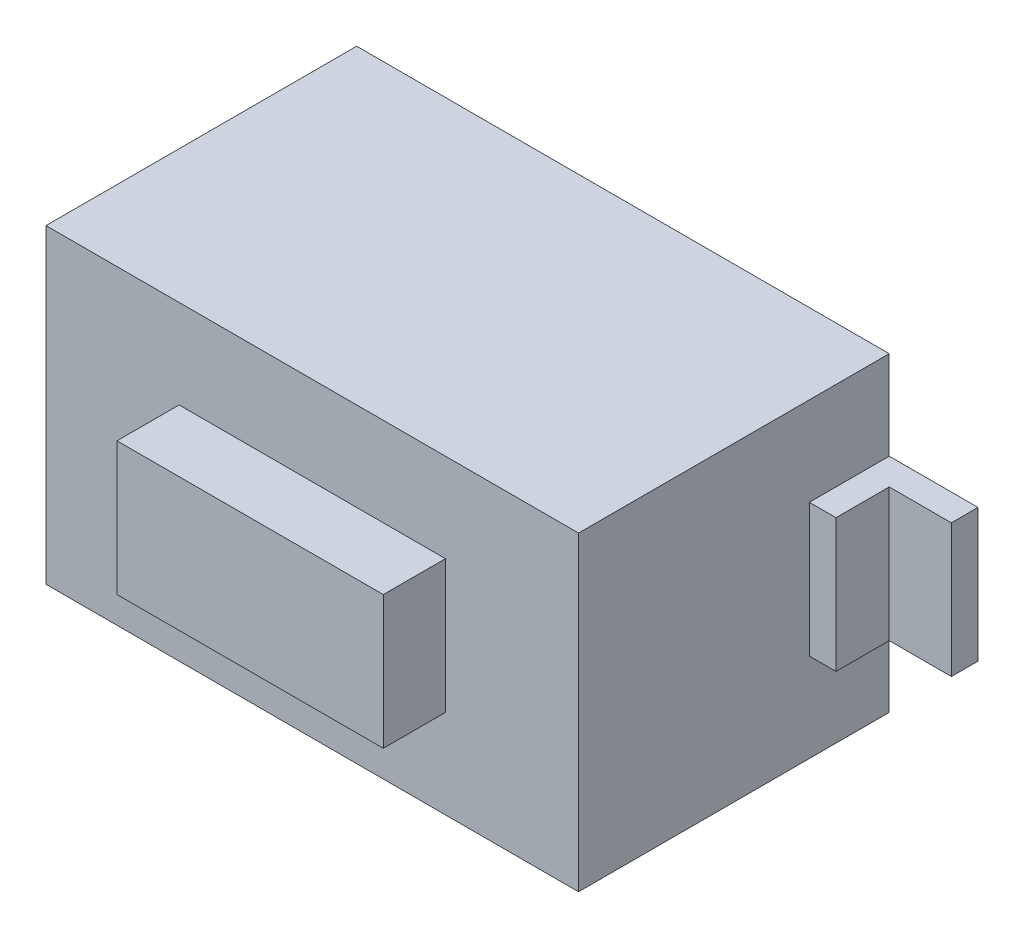
ISO-10303-21;
HEADER;
FILE_DESCRIPTION(('STEP AP214'),'2;1');
FILE_NAME('part.step','',(''),(''),'','','');
FILE_SCHEMA(('AUTOMOTIVE_DESIGN { 1 0 10303 214 1 1 1 1 }'));
ENDSEC;
DATA;
#1=APPLICATION_CONTEXT('core data for automotive mechanical design processes');
#2=APPLICATION_PROTOCOL_DEFINITION('international standard','automotive_design',2000,#1);
#3=PRODUCT_CONTEXT('',#1,'mechanical');
#4=PRODUCT('Part','Part','',(#3));
#5=PRODUCT_RELATED_PRODUCT_CATEGORY('part','',(#4));
#6=PRODUCT_DEFINITION_FORMATION('','',#4);
#7=PRODUCT_DEFINITION_CONTEXT('part definition',#1,'design');
#8=PRODUCT_DEFINITION('design','',#6,#7);
#9=PRODUCT_DEFINITION_SHAPE('','',#8);
#10=(LENGTH_UNIT() NAMED_UNIT(*) SI_UNIT(.MILLI.,.METRE.));
#11=(NAMED_UNIT(*) PLANE_ANGLE_UNIT() SI_UNIT($,.RADIAN.));
#12=(NAMED_UNIT(*) SI_UNIT($,.STERADIAN.) SOLID_ANGLE_UNIT());
#13=UNCERTAINTY_MEASURE_WITH_UNIT(LENGTH_MEASURE(1.E-05),#10,'distance_accuracy_value','');
#14=(GEOMETRIC_REPRESENTATION_CONTEXT(3) GLOBAL_UNCERTAINTY_ASSIGNED_CONTEXT((#13)) GLOBAL_UNIT_ASSIGNED_CONTEXT((#10,
#11,#12)) REPRESENTATION_CONTEXT('',''));
#15=CARTESIAN_POINT('',(0.,0.,0.));
#16=DIRECTION('',(0.,0.,1.));
#17=DIRECTION('',(1.,0.,0.));
#18=AXIS2_PLACEMENT_3D('',#15,#16,#17);
#19=CARTESIAN_POINT('',(-3.,-1.75,3.5));
#20=DIRECTION('',(1.,0.,0.));
#21=DIRECTION('',(0.,0.,-1.));
#22=AXIS2_PLACEMENT_3D('',#19,#20,#21);
#23=PLANE('',#22);
#24=DIRECTION('',(0.,1.,0.));
#25=VECTOR('',#24,1.);
#26=CARTESIAN_POINT('',(-3.,-0.75,0.9));
#27=LINE('',#26,#25);
#28=CARTESIAN_POINT('',(-3.,-0.750000000000001,0.9));
#29=VERTEX_POINT('',#28);
#30=CARTESIAN_POINT('',(-3.,0.75,0.9));
#31=VERTEX_POINT('',#30);
#32=EDGE_CURVE('E254',#29,#31,#27,.T.);
#33=ORIENTED_EDGE('',*,*,#32,.F.);
#34=DIRECTION('',(0.,0.,1.));
#35=VECTOR('',#34,1.);
#36=CARTESIAN_POINT('',(-3.,-0.75,0.));
#37=LINE('',#36,#35);
#38=CARTESIAN_POINT('',(-3.,-0.75,0.));
#39=VERTEX_POINT('',#38);
#40=EDGE_CURVE('E278',#39,#29,#37,.T.);
#41=ORIENTED_EDGE('',*,*,#40,.F.);
#42=DIRECTION('',(0.,-1.,0.));
#43=VECTOR('',#42,1.);
#44=CARTESIAN_POINT('',(-3.,-1.75,0.));
#45=LINE('',#44,#43);
#46=CARTESIAN_POINT('',(-3.,-1.75,0.));
#47=VERTEX_POINT('',#46);
#48=EDGE_CURVE('E373',#39,#47,#45,.T.);
#49=ORIENTED_EDGE('',*,*,#48,.T.);
#50=DIRECTION('',(0.,0.,-1.));
#51=VECTOR('',#50,1.);
#52=CARTESIAN_POINT('',(-3.,-1.75,3.5));
#53=LINE('',#52,#51);
#54=CARTESIAN_POINT('',(-3.,-1.75,3.5));
#55=VERTEX_POINT('',#54);
#56=EDGE_CURVE('E381',#55,#47,#53,.T.);
#57=ORIENTED_EDGE('',*,*,#56,.F.);
#58=DIRECTION('',(0.,-1.,0.));
#59=VECTOR('',#58,1.);
#60=CARTESIAN_POINT('',(-3.,-1.75,3.5));
#61=LINE('',#60,#59);
#62=CARTESIAN_POINT('',(-3.,1.75,3.5));
#63=VERTEX_POINT('',#62);
#64=EDGE_CURVE('E360',#63,#55,#61,.T.);
#65=ORIENTED_EDGE('',*,*,#64,.F.);
#66=DIRECTION('',(0.,0.,-1.));
#67=VECTOR('',#66,1.);
#68=CARTESIAN_POINT('',(-3.,1.75,3.5));
#69=LINE('',#68,#67);
#70=CARTESIAN_POINT('',(-3.,1.75,0.));
#71=VERTEX_POINT('',#70);
#72=EDGE_CURVE('E47',#63,#71,#69,.T.);
#73=ORIENTED_EDGE('',*,*,#72,.T.);
#74=CARTESIAN_POINT('',(-3.,0.75,0.));
#75=VERTEX_POINT('',#74);
#76=EDGE_CURVE('E374',#71,#75,#45,.T.);
#77=ORIENTED_EDGE('',*,*,#76,.T.);
#78=DIRECTION('',(0.,0.,-1.));
#79=VECTOR('',#78,1.);
#80=CARTESIAN_POINT('',(-3.,0.75,0.));
#81=LINE('',#80,#79);
#82=EDGE_CURVE('E272',#31,#75,#81,.T.);
#83=ORIENTED_EDGE('',*,*,#82,.F.);
#84=EDGE_LOOP('',(#33,#41,#49,#57,#65,#73,#77,#83));
#85=FACE_BOUND('',#84,.T.);
#86=ADVANCED_FACE('F38',(#85),#23,.F.);
#87=CARTESIAN_POINT('',(-4.,0.75,0.3));
#88=DIRECTION('',(0.,0.,-1.));
#89=DIRECTION('',(0.,1.,0.));
#90=AXIS2_PLACEMENT_3D('',#87,#88,#89);
#91=PLANE('',#90);
#92=DIRECTION('',(0.,-1.,0.));
#93=VECTOR('',#92,1.);
#94=CARTESIAN_POINT('',(-3.3,-0.75,0.3));
#95=LINE('',#94,#93);
#96=CARTESIAN_POINT('',(-3.3,0.75,0.3));
#97=VERTEX_POINT('',#96);
#98=CARTESIAN_POINT('',(-3.3,-0.75,0.3));
#99=VERTEX_POINT('',#98);
#100=EDGE_CURVE('E245',#97,#99,#95,.T.);
#101=ORIENTED_EDGE('',*,*,#100,.F.);
#102=DIRECTION('',(1.,0.,0.));
#103=VECTOR('',#102,1.);
#104=CARTESIAN_POINT('',(-4.,0.75,0.3));
#105=LINE('',#104,#103);
#106=CARTESIAN_POINT('',(-4.,0.75,0.3));
#107=VERTEX_POINT('',#106);
#108=EDGE_CURVE('E303',#107,#97,#105,.T.);
#109=ORIENTED_EDGE('',*,*,#108,.F.);
#110=DIRECTION('',(0.,1.,0.));
#111=VECTOR('',#110,1.);
#112=CARTESIAN_POINT('',(-4.,0.75,0.3));
#113=LINE('',#112,#111);
#114=CARTESIAN_POINT('',(-4.,-0.75,0.3));
#115=VERTEX_POINT('',#114);
#116=EDGE_CURVE('E273',#115,#107,#113,.T.);
#117=ORIENTED_EDGE('',*,*,#116,.F.);
#118=DIRECTION('',(1.,0.,0.));
#119=VECTOR('',#118,1.);
#120=CARTESIAN_POINT('',(-4.,-0.75,0.3));
#121=LINE('',#120,#119);
#122=EDGE_CURVE('E287',#115,#99,#121,.T.);
#123=ORIENTED_EDGE('',*,*,#122,.T.);
#124=EDGE_LOOP('',(#101,#109,#117,#123));
#125=FACE_BOUND('',#124,.T.);
#126=ADVANCED_FACE('F445',(#125),#91,.F.);
#127=CARTESIAN_POINT('',(0.,0.,3.5));
#128=DIRECTION('',(0.,0.,-1.));
#129=DIRECTION('',(-1.,0.,0.));
#130=AXIS2_PLACEMENT_3D('',#127,#128,#129);
#131=PLANE('',#130);
#132=DIRECTION('',(0.,1.,0.));
#133=VECTOR('',#132,1.);
#134=CARTESIAN_POINT('',(3.,-1.75,3.5));
#135=LINE('',#134,#133);
#136=CARTESIAN_POINT('',(3.,-1.75,3.5));
#137=VERTEX_POINT('',#136);
#138=CARTESIAN_POINT('',(3.,1.75,3.5));
#139=VERTEX_POINT('',#138);
#140=EDGE_CURVE('E352',#137,#139,#135,.T.);
#141=ORIENTED_EDGE('',*,*,#140,.T.);
#142=DIRECTION('',(-1.,0.,0.));
#143=VECTOR('',#142,1.);
#144=CARTESIAN_POINT('',(-3.,1.75,3.5));
#145=LINE('',#144,#143);
#146=EDGE_CURVE('E356',#139,#63,#145,.T.);
#147=ORIENTED_EDGE('',*,*,#146,.T.);
#148=ORIENTED_EDGE('',*,*,#64,.T.);
#149=DIRECTION('',(1.,0.,0.));
#150=VECTOR('',#149,1.);
#151=CARTESIAN_POINT('',(-3.,-1.75,3.5));
#152=LINE('',#151,#150);
#153=EDGE_CURVE('E363',#55,#137,#152,.T.);
#154=ORIENTED_EDGE('',*,*,#153,.T.);
#155=EDGE_LOOP('',(#141,#147,#148,#154));
#156=FACE_BOUND('',#155,.T.);
#157=DIRECTION('',(0.,-1.,0.));
#158=VECTOR('',#157,1.);
#159=CARTESIAN_POINT('',(-1.5,0.75,3.5));
#160=LINE('',#159,#158);
#161=CARTESIAN_POINT('',(-1.5,0.75,3.5));
#162=VERTEX_POINT('',#161);
#163=CARTESIAN_POINT('',(-1.5,-0.75,3.5));
#164=VERTEX_POINT('',#163);
#165=EDGE_CURVE('E307',#162,#164,#160,.T.);
#166=ORIENTED_EDGE('',*,*,#165,.F.);
#167=DIRECTION('',(-1.,0.,0.));
#168=VECTOR('',#167,1.);
#169=CARTESIAN_POINT('',(1.5,0.75,3.5));
#170=LINE('',#169,#168);
#171=CARTESIAN_POINT('',(1.5,0.75,3.5));
#172=VERTEX_POINT('',#171);
#173=EDGE_CURVE('E313',#172,#162,#170,.T.);
#174=ORIENTED_EDGE('',*,*,#173,.F.);
#175=DIRECTION('',(0.,1.,0.));
#176=VECTOR('',#175,1.);
#177=CARTESIAN_POINT('',(1.5,0.75,3.5));
#178=LINE('',#177,#176);
#179=CARTESIAN_POINT('',(1.5,-0.75,3.5));
#180=VERTEX_POINT('',#179);
#181=EDGE_CURVE('E330',#180,#172,#178,.T.);
#182=ORIENTED_EDGE('',*,*,#181,.F.);
#183=DIRECTION('',(1.,0.,0.));
#184=VECTOR('',#183,1.);
#185=CARTESIAN_POINT('',(1.5,-0.75,3.5));
#186=LINE('',#185,#184);
#187=EDGE_CURVE('E326',#164,#180,#186,.T.);
#188=ORIENTED_EDGE('',*,*,#187,.F.);
#189=EDGE_LOOP('',(#166,#174,#182,#188));
#190=FACE_BOUND('',#189,.T.);
#191=ADVANCED_FACE('F434',(#156,#190),#131,.F.);
#192=CARTESIAN_POINT('',(3.,-1.75,3.5));
#193=DIRECTION('',(-1.,0.,0.));
#194=DIRECTION('',(0.,0.,1.));
#195=AXIS2_PLACEMENT_3D('',#192,#193,#194);
#196=PLANE('',#195);
#197=DIRECTION('',(0.,1.,0.));
#198=VECTOR('',#197,1.);
#199=CARTESIAN_POINT('',(3.,-0.75,0.9));
#200=LINE('',#199,#198);
#201=CARTESIAN_POINT('',(3.,-0.750000000000001,0.9));
#202=VERTEX_POINT('',#201);
#203=CARTESIAN_POINT('',(3.,0.75,0.9));
#204=VERTEX_POINT('',#203);
#205=EDGE_CURVE('E199',#202,#204,#200,.T.);
#206=ORIENTED_EDGE('',*,*,#205,.T.);
#207=DIRECTION('',(0.,0.,-1.));
#208=VECTOR('',#207,1.);
#209=CARTESIAN_POINT('',(3.,0.75,0.));
#210=LINE('',#209,#208);
#211=CARTESIAN_POINT('',(3.,0.75,0.));
#212=VERTEX_POINT('',#211);
#213=EDGE_CURVE('E54',#204,#212,#210,.T.);
#214=ORIENTED_EDGE('',*,*,#213,.T.);
#215=DIRECTION('',(0.,1.,0.));
#216=VECTOR('',#215,1.);
#217=CARTESIAN_POINT('',(3.,-1.75,0.));
#218=LINE('',#217,#216);
#219=CARTESIAN_POINT('',(3.,1.75,0.));
#220=VERTEX_POINT('',#219);
#221=EDGE_CURVE('E351',#212,#220,#218,.T.);
#222=ORIENTED_EDGE('',*,*,#221,.T.);
#223=DIRECTION('',(0.,0.,-1.));
#224=VECTOR('',#223,1.);
#225=CARTESIAN_POINT('',(3.,1.75,3.5));
#226=LINE('',#225,#224);
#227=EDGE_CURVE('E11',#139,#220,#226,.T.);
#228=ORIENTED_EDGE('',*,*,#227,.F.);
#229=ORIENTED_EDGE('',*,*,#140,.F.);
#230=DIRECTION('',(0.,0.,-1.));
#231=VECTOR('',#230,1.);
#232=CARTESIAN_POINT('',(3.,-1.75,3.5));
#233=LINE('',#232,#231);
#234=CARTESIAN_POINT('',(3.,-1.75,0.));
#235=VERTEX_POINT('',#234);
#236=EDGE_CURVE('E366',#137,#235,#233,.T.);
#237=ORIENTED_EDGE('',*,*,#236,.T.);
#238=CARTESIAN_POINT('',(3.,-0.75,0.));
#239=VERTEX_POINT('',#238);
#240=EDGE_CURVE('E367',#235,#239,#218,.T.);
#241=ORIENTED_EDGE('',*,*,#240,.T.);
#242=DIRECTION('',(0.,0.,1.));
#243=VECTOR('',#242,1.);
#244=CARTESIAN_POINT('',(3.,-0.75,0.));
#245=LINE('',#244,#243);
#246=EDGE_CURVE('E61',#239,#202,#245,.T.);
#247=ORIENTED_EDGE('',*,*,#246,.T.);
#248=EDGE_LOOP('',(#206,#214,#222,#228,#229,#237,#241,#247));
#249=FACE_BOUND('',#248,.T.);
#250=ADVANCED_FACE('F40',(#249),#196,.F.);
#251=CARTESIAN_POINT('',(-3.,1.75,3.5));
#252=DIRECTION('',(0.,-1.,0.));
#253=DIRECTION('',(0.,0.,-1.));
#254=AXIS2_PLACEMENT_3D('',#251,#252,#253);
#255=PLANE('',#254);
#256=DIRECTION('',(-1.,0.,0.));
#257=VECTOR('',#256,1.);
#258=CARTESIAN_POINT('',(-3.,1.75,0.));
#259=LINE('',#258,#257);
#260=EDGE_CURVE('E370',#220,#71,#259,.T.);
#261=ORIENTED_EDGE('',*,*,#260,.T.);
#262=ORIENTED_EDGE('',*,*,#72,.F.);
#263=ORIENTED_EDGE('',*,*,#146,.F.);
#264=ORIENTED_EDGE('',*,*,#227,.T.);
#265=EDGE_LOOP('',(#261,#262,#263,#264));
#266=FACE_BOUND('',#265,.T.);
#267=ADVANCED_FACE('F436',(#266),#255,.F.);
#268=CARTESIAN_POINT('',(-3.,-1.75,3.5));
#269=DIRECTION('',(0.,1.,0.));
#270=DIRECTION('',(0.,0.,1.));
#271=AXIS2_PLACEMENT_3D('',#268,#269,#270);
#272=PLANE('',#271);
#273=DIRECTION('',(1.,0.,0.));
#274=VECTOR('',#273,1.);
#275=CARTESIAN_POINT('',(-3.,-1.75,0.));
#276=LINE('',#275,#274);
#277=EDGE_CURVE('E357',#47,#235,#276,.T.);
#278=ORIENTED_EDGE('',*,*,#277,.T.);
#279=ORIENTED_EDGE('',*,*,#236,.F.);
#280=ORIENTED_EDGE('',*,*,#153,.F.);
#281=ORIENTED_EDGE('',*,*,#56,.T.);
#282=EDGE_LOOP('',(#278,#279,#280,#281));
#283=FACE_BOUND('',#282,.T.);
#284=ADVANCED_FACE('F432',(#283),#272,.F.);
#285=CARTESIAN_POINT('',(0.,0.,0.));
#286=DIRECTION('',(0.,0.,-1.));
#287=DIRECTION('',(-1.,0.,0.));
#288=AXIS2_PLACEMENT_3D('',#285,#286,#287);
#289=PLANE('',#288);
#290=ORIENTED_EDGE('',*,*,#240,.F.);
#291=ORIENTED_EDGE('',*,*,#277,.F.);
#292=ORIENTED_EDGE('',*,*,#48,.F.);
#293=DIRECTION('',(1.,0.,0.));
#294=VECTOR('',#293,1.);
#295=CARTESIAN_POINT('',(-4.,-0.75,0.));
#296=LINE('',#295,#294);
#297=CARTESIAN_POINT('',(-4.,-0.75,0.));
#298=VERTEX_POINT('',#297);
#299=EDGE_CURVE('E295',#298,#39,#296,.T.);
#300=ORIENTED_EDGE('',*,*,#299,.F.);
#301=DIRECTION('',(0.,-1.,0.));
#302=VECTOR('',#301,1.);
#303=CARTESIAN_POINT('',(-4.,0.75,0.));
#304=LINE('',#303,#302);
#305=CARTESIAN_POINT('',(-4.,0.75,0.));
#306=VERTEX_POINT('',#305);
#307=EDGE_CURVE('E281',#306,#298,#304,.T.);
#308=ORIENTED_EDGE('',*,*,#307,.F.);
#309=DIRECTION('',(1.,0.,0.));
#310=VECTOR('',#309,1.);
#311=CARTESIAN_POINT('',(-4.,0.75,0.));
#312=LINE('',#311,#310);
#313=EDGE_CURVE('E299',#306,#75,#312,.T.);
#314=ORIENTED_EDGE('',*,*,#313,.T.);
#315=ORIENTED_EDGE('',*,*,#76,.F.);
#316=ORIENTED_EDGE('',*,*,#260,.F.);
#317=ORIENTED_EDGE('',*,*,#221,.F.);
#318=DIRECTION('',(-1.,0.,0.));
#319=VECTOR('',#318,1.);
#320=CARTESIAN_POINT('',(4.,0.75,0.));
#321=LINE('',#320,#319);
#322=CARTESIAN_POINT('',(4.,0.75,0.));
#323=VERTEX_POINT('',#322);
#324=EDGE_CURVE('E235',#323,#212,#321,.T.);
#325=ORIENTED_EDGE('',*,*,#324,.F.);
#326=DIRECTION('',(0.,-1.,0.));
#327=VECTOR('',#326,1.);
#328=CARTESIAN_POINT('',(4.,0.75,0.));
#329=LINE('',#328,#327);
#330=CARTESIAN_POINT('',(4.,-0.75,0.));
#331=VERTEX_POINT('',#330);
#332=EDGE_CURVE('E220',#323,#331,#329,.T.);
#333=ORIENTED_EDGE('',*,*,#332,.T.);
#334=DIRECTION('',(-1.,0.,0.));
#335=VECTOR('',#334,1.);
#336=CARTESIAN_POINT('',(4.,-0.75,0.));
#337=LINE('',#336,#335);
#338=EDGE_CURVE('E238',#331,#239,#337,.T.);
#339=ORIENTED_EDGE('',*,*,#338,.T.);
#340=EDGE_LOOP('',(#290,#291,#292,#300,#308,#314,#315,#316,#317,#325,#333,#339));
#341=FACE_BOUND('',#340,.T.);
#342=ADVANCED_FACE('F396',(#341),#289,.T.);
#343=CARTESIAN_POINT('',(-1.5,0.75,4.2));
#344=DIRECTION('',(1.,0.,0.));
#345=DIRECTION('',(0.,0.,-1.));
#346=AXIS2_PLACEMENT_3D('',#343,#344,#345);
#347=PLANE('',#346);
#348=ORIENTED_EDGE('',*,*,#165,.T.);
#349=DIRECTION('',(0.,0.,-1.));
#350=VECTOR('',#349,1.);
#351=CARTESIAN_POINT('',(-1.5,-0.75,4.2));
#352=LINE('',#351,#350);
#353=CARTESIAN_POINT('',(-1.5,-0.75,4.2));
#354=VERTEX_POINT('',#353);
#355=EDGE_CURVE('E347',#354,#164,#352,.T.);
#356=ORIENTED_EDGE('',*,*,#355,.F.);
#357=DIRECTION('',(0.,-1.,0.));
#358=VECTOR('',#357,1.);
#359=CARTESIAN_POINT('',(-1.5,0.75,4.2));
#360=LINE('',#359,#358);
#361=CARTESIAN_POINT('',(-1.5,0.75,4.2));
#362=VERTEX_POINT('',#361);
#363=EDGE_CURVE('E308',#362,#354,#360,.T.);
#364=ORIENTED_EDGE('',*,*,#363,.F.);
#365=DIRECTION('',(0.,0.,-1.));
#366=VECTOR('',#365,1.);
#367=CARTESIAN_POINT('',(-1.5,0.75,4.2));
#368=LINE('',#367,#366);
#369=EDGE_CURVE('E322',#362,#162,#368,.T.);
#370=ORIENTED_EDGE('',*,*,#369,.T.);
#371=EDGE_LOOP('',(#348,#356,#364,#370));
#372=FACE_BOUND('',#371,.T.);
#373=ADVANCED_FACE('F454',(#372),#347,.F.);
#374=CARTESIAN_POINT('',(1.5,-0.75,4.2));
#375=DIRECTION('',(0.,1.,0.));
#376=DIRECTION('',(-1.,0.,0.));
#377=AXIS2_PLACEMENT_3D('',#374,#375,#376);
#378=PLANE('',#377);
#379=ORIENTED_EDGE('',*,*,#187,.T.);
#380=DIRECTION('',(0.,0.,-1.));
#381=VECTOR('',#380,1.);
#382=CARTESIAN_POINT('',(1.5,-0.75,4.2));
#383=LINE('',#382,#381);
#384=CARTESIAN_POINT('',(1.5,-0.75,4.2));
#385=VERTEX_POINT('',#384);
#386=EDGE_CURVE('E344',#385,#180,#383,.T.);
#387=ORIENTED_EDGE('',*,*,#386,.F.);
#388=DIRECTION('',(1.,0.,0.));
#389=VECTOR('',#388,1.);
#390=CARTESIAN_POINT('',(1.5,-0.75,4.2));
#391=LINE('',#390,#389);
#392=EDGE_CURVE('E312',#354,#385,#391,.T.);
#393=ORIENTED_EDGE('',*,*,#392,.F.);
#394=ORIENTED_EDGE('',*,*,#355,.T.);
#395=EDGE_LOOP('',(#379,#387,#393,#394));
#396=FACE_BOUND('',#395,.T.);
#397=ADVANCED_FACE('F459',(#396),#378,.F.);
#398=CARTESIAN_POINT('',(1.5,0.75,4.2));
#399=DIRECTION('',(-1.,0.,0.));
#400=DIRECTION('',(0.,0.,1.));
#401=AXIS2_PLACEMENT_3D('',#398,#399,#400);
#402=PLANE('',#401);
#403=ORIENTED_EDGE('',*,*,#181,.T.);
#404=DIRECTION('',(0.,0.,-1.));
#405=VECTOR('',#404,1.);
#406=CARTESIAN_POINT('',(1.5,0.75,4.2));
#407=LINE('',#406,#405);
#408=CARTESIAN_POINT('',(1.5,0.75,4.2));
#409=VERTEX_POINT('',#408);
#410=EDGE_CURVE('E340',#409,#172,#407,.T.);
#411=ORIENTED_EDGE('',*,*,#410,.F.);
#412=DIRECTION('',(0.,1.,0.));
#413=VECTOR('',#412,1.);
#414=CARTESIAN_POINT('',(1.5,0.75,4.2));
#415=LINE('',#414,#413);
#416=EDGE_CURVE('E316',#385,#409,#415,.T.);
#417=ORIENTED_EDGE('',*,*,#416,.F.);
#418=ORIENTED_EDGE('',*,*,#386,.T.);
#419=EDGE_LOOP('',(#403,#411,#417,#418));
#420=FACE_BOUND('',#419,.T.);
#421=ADVANCED_FACE('F463',(#420),#402,.F.);
#422=CARTESIAN_POINT('',(1.5,0.75,4.2));
#423=DIRECTION('',(0.,-1.,0.));
#424=DIRECTION('',(1.,0.,0.));
#425=AXIS2_PLACEMENT_3D('',#422,#423,#424);
#426=PLANE('',#425);
#427=ORIENTED_EDGE('',*,*,#173,.T.);
#428=ORIENTED_EDGE('',*,*,#369,.F.);
#429=DIRECTION('',(-1.,0.,0.));
#430=VECTOR('',#429,1.);
#431=CARTESIAN_POINT('',(1.5,0.75,4.2));
#432=LINE('',#431,#430);
#433=EDGE_CURVE('E319',#409,#362,#432,.T.);
#434=ORIENTED_EDGE('',*,*,#433,.F.);
#435=ORIENTED_EDGE('',*,*,#410,.T.);
#436=EDGE_LOOP('',(#427,#428,#434,#435));
#437=FACE_BOUND('',#436,.T.);
#438=ADVANCED_FACE('F467',(#437),#426,.F.);
#439=CARTESIAN_POINT('',(0.,0.,4.2));
#440=DIRECTION('',(0.,0.,-1.));
#441=DIRECTION('',(-1.,0.,0.));
#442=AXIS2_PLACEMENT_3D('',#439,#440,#441);
#443=PLANE('',#442);
#444=ORIENTED_EDGE('',*,*,#363,.T.);
#445=ORIENTED_EDGE('',*,*,#392,.T.);
#446=ORIENTED_EDGE('',*,*,#416,.T.);
#447=ORIENTED_EDGE('',*,*,#433,.T.);
#448=EDGE_LOOP('',(#444,#445,#446,#447));
#449=FACE_BOUND('',#448,.T.);
#450=ADVANCED_FACE('F471',(#449),#443,.F.);
#451=CARTESIAN_POINT('',(-4.,0.75,0.));
#452=DIRECTION('',(0.,-1.,0.));
#453=DIRECTION('',(0.,0.,-1.));
#454=AXIS2_PLACEMENT_3D('',#451,#452,#453);
#455=PLANE('',#454);
#456=ORIENTED_EDGE('',*,*,#82,.T.);
#457=ORIENTED_EDGE('',*,*,#313,.F.);
#458=DIRECTION('',(0.,0.,-1.));
#459=VECTOR('',#458,1.);
#460=CARTESIAN_POINT('',(-4.,0.75,0.));
#461=LINE('',#460,#459);
#462=EDGE_CURVE('E277',#107,#306,#461,.T.);
#463=ORIENTED_EDGE('',*,*,#462,.F.);
#464=ORIENTED_EDGE('',*,*,#108,.T.);
#465=DIRECTION('',(0.,0.,-1.));
#466=VECTOR('',#465,1.);
#467=CARTESIAN_POINT('',(-3.3,0.75,0.9));
#468=LINE('',#467,#466);
#469=CARTESIAN_POINT('',(-3.3,0.75,0.9));
#470=VERTEX_POINT('',#469);
#471=EDGE_CURVE('E261',#470,#97,#468,.T.);
#472=ORIENTED_EDGE('',*,*,#471,.F.);
#473=DIRECTION('',(-1.,0.,0.));
#474=VECTOR('',#473,1.);
#475=CARTESIAN_POINT('',(-3.,0.75,0.9));
#476=LINE('',#475,#474);
#477=EDGE_CURVE('E258',#31,#470,#476,.T.);
#478=ORIENTED_EDGE('',*,*,#477,.F.);
#479=EDGE_LOOP('',(#456,#457,#463,#464,#472,#478));
#480=FACE_BOUND('',#479,.T.);
#481=ADVANCED_FACE('F402',(#480),#455,.F.);
#482=CARTESIAN_POINT('',(-4.,-0.75,0.));
#483=DIRECTION('',(0.,1.,0.));
#484=DIRECTION('',(0.,0.,1.));
#485=AXIS2_PLACEMENT_3D('',#482,#483,#484);
#486=PLANE('',#485);
#487=ORIENTED_EDGE('',*,*,#40,.T.);
#488=DIRECTION('',(1.,0.,0.));
#489=VECTOR('',#488,1.);
#490=CARTESIAN_POINT('',(-3.,-0.75,0.9));
#491=LINE('',#490,#489);
#492=CARTESIAN_POINT('',(-3.3,-0.75,0.9));
#493=VERTEX_POINT('',#492);
#494=EDGE_CURVE('E250',#493,#29,#491,.T.);
#495=ORIENTED_EDGE('',*,*,#494,.F.);
#496=DIRECTION('',(0.,0.,-1.));
#497=VECTOR('',#496,1.);
#498=CARTESIAN_POINT('',(-3.3,-0.75,0.9));
#499=LINE('',#498,#497);
#500=EDGE_CURVE('E268',#493,#99,#499,.T.);
#501=ORIENTED_EDGE('',*,*,#500,.T.);
#502=ORIENTED_EDGE('',*,*,#122,.F.);
#503=DIRECTION('',(0.,0.,1.));
#504=VECTOR('',#503,1.);
#505=CARTESIAN_POINT('',(-4.,-0.75,0.));
#506=LINE('',#505,#504);
#507=EDGE_CURVE('E284',#298,#115,#506,.T.);
#508=ORIENTED_EDGE('',*,*,#507,.F.);
#509=ORIENTED_EDGE('',*,*,#299,.T.);
#510=EDGE_LOOP('',(#487,#495,#501,#502,#508,#509));
#511=FACE_BOUND('',#510,.T.);
#512=ADVANCED_FACE('F410',(#511),#486,.F.);
#513=CARTESIAN_POINT('',(-4.,0.,0.));
#514=DIRECTION('',(-1.,0.,0.));
#515=DIRECTION('',(0.,0.,1.));
#516=AXIS2_PLACEMENT_3D('',#513,#514,#515);
#517=PLANE('',#516);
#518=ORIENTED_EDGE('',*,*,#116,.T.);
#519=ORIENTED_EDGE('',*,*,#462,.T.);
#520=ORIENTED_EDGE('',*,*,#307,.T.);
#521=ORIENTED_EDGE('',*,*,#507,.T.);
#522=EDGE_LOOP('',(#518,#519,#520,#521));
#523=FACE_BOUND('',#522,.T.);
#524=ADVANCED_FACE('F480',(#523),#517,.T.);
#525=CARTESIAN_POINT('',(-3.3,-0.75,0.9));
#526=DIRECTION('',(1.,0.,0.));
#527=DIRECTION('',(0.,1.,0.));
#528=AXIS2_PLACEMENT_3D('',#525,#526,#527);
#529=PLANE('',#528);
#530=ORIENTED_EDGE('',*,*,#100,.T.);
#531=ORIENTED_EDGE('',*,*,#500,.F.);
#532=DIRECTION('',(0.,-1.,0.));
#533=VECTOR('',#532,1.);
#534=CARTESIAN_POINT('',(-3.3,-0.75,0.9));
#535=LINE('',#534,#533);
#536=EDGE_CURVE('E246',#470,#493,#535,.T.);
#537=ORIENTED_EDGE('',*,*,#536,.F.);
#538=ORIENTED_EDGE('',*,*,#471,.T.);
#539=EDGE_LOOP('',(#530,#531,#537,#538));
#540=FACE_BOUND('',#539,.T.);
#541=ADVANCED_FACE('F483',(#540),#529,.F.);
#542=CARTESIAN_POINT('',(0.,0.,0.9));
#543=DIRECTION('',(0.,0.,1.));
#544=DIRECTION('',(1.,0.,0.));
#545=AXIS2_PLACEMENT_3D('',#542,#543,#544);
#546=PLANE('',#545);
#547=ORIENTED_EDGE('',*,*,#536,.T.);
#548=ORIENTED_EDGE('',*,*,#494,.T.);
#549=ORIENTED_EDGE('',*,*,#32,.T.);
#550=ORIENTED_EDGE('',*,*,#477,.T.);
#551=EDGE_LOOP('',(#547,#548,#549,#550));
#552=FACE_BOUND('',#551,.T.);
#553=ADVANCED_FACE('F406',(#552),#546,.T.);
#554=CARTESIAN_POINT('',(4.,0.75,0.3));
#555=DIRECTION('',(0.,0.,1.));
#556=DIRECTION('',(0.,-1.,0.));
#557=AXIS2_PLACEMENT_3D('',#554,#555,#556);
#558=PLANE('',#557);
#559=DIRECTION('',(0.,-1.,0.));
#560=VECTOR('',#559,1.);
#561=CARTESIAN_POINT('',(3.3,-0.75,0.3));
#562=LINE('',#561,#560);
#563=CARTESIAN_POINT('',(3.3,0.75,0.3));
#564=VERTEX_POINT('',#563);
#565=CARTESIAN_POINT('',(3.3,-0.75,0.3));
#566=VERTEX_POINT('',#565);
#567=EDGE_CURVE('E185',#564,#566,#562,.T.);
#568=ORIENTED_EDGE('',*,*,#567,.T.);
#569=DIRECTION('',(-1.,0.,0.));
#570=VECTOR('',#569,1.);
#571=CARTESIAN_POINT('',(4.,-0.75,0.3));
#572=LINE('',#571,#570);
#573=CARTESIAN_POINT('',(4.,-0.75,0.3));
#574=VERTEX_POINT('',#573);
#575=EDGE_CURVE('E241',#574,#566,#572,.T.);
#576=ORIENTED_EDGE('',*,*,#575,.F.);
#577=DIRECTION('',(0.,1.,0.));
#578=VECTOR('',#577,1.);
#579=CARTESIAN_POINT('',(4.,0.75,0.3));
#580=LINE('',#579,#578);
#581=CARTESIAN_POINT('',(4.,0.75,0.3));
#582=VERTEX_POINT('',#581);
#583=EDGE_CURVE('E212',#574,#582,#580,.T.);
#584=ORIENTED_EDGE('',*,*,#583,.T.);
#585=DIRECTION('',(-1.,0.,0.));
#586=VECTOR('',#585,1.);
#587=CARTESIAN_POINT('',(4.,0.75,0.3));
#588=LINE('',#587,#586);
#589=EDGE_CURVE('E228',#582,#564,#588,.T.);
#590=ORIENTED_EDGE('',*,*,#589,.T.);
#591=EDGE_LOOP('',(#568,#576,#584,#590));
#592=FACE_BOUND('',#591,.T.);
#593=ADVANCED_FACE('F426',(#592),#558,.T.);
#594=CARTESIAN_POINT('',(4.,-0.75,0.));
#595=DIRECTION('',(0.,-1.,0.));
#596=DIRECTION('',(0.,0.,-1.));
#597=AXIS2_PLACEMENT_3D('',#594,#595,#596);
#598=PLANE('',#597);
#599=ORIENTED_EDGE('',*,*,#246,.F.);
#600=ORIENTED_EDGE('',*,*,#338,.F.);
#601=DIRECTION('',(0.,0.,1.));
#602=VECTOR('',#601,1.);
#603=CARTESIAN_POINT('',(4.,-0.75,0.));
#604=LINE('',#603,#602);
#605=EDGE_CURVE('E216',#331,#574,#604,.T.);
#606=ORIENTED_EDGE('',*,*,#605,.T.);
#607=ORIENTED_EDGE('',*,*,#575,.T.);
#608=DIRECTION('',(0.,0.,-1.));
#609=VECTOR('',#608,1.);
#610=CARTESIAN_POINT('',(3.3,-0.75,0.9));
#611=LINE('',#610,#609);
#612=CARTESIAN_POINT('',(3.3,-0.75,0.9));
#613=VERTEX_POINT('',#612);
#614=EDGE_CURVE('E187',#613,#566,#611,.T.);
#615=ORIENTED_EDGE('',*,*,#614,.F.);
#616=DIRECTION('',(-1.,0.,0.));
#617=VECTOR('',#616,1.);
#618=CARTESIAN_POINT('',(3.,-0.75,0.9));
#619=LINE('',#618,#617);
#620=EDGE_CURVE('E194',#613,#202,#619,.T.);
#621=ORIENTED_EDGE('',*,*,#620,.T.);
#622=EDGE_LOOP('',(#599,#600,#606,#607,#615,#621));
#623=FACE_BOUND('',#622,.T.);
#624=ADVANCED_FACE('F428',(#623),#598,.T.);
#625=CARTESIAN_POINT('',(4.,0.75,0.));
#626=DIRECTION('',(0.,1.,0.));
#627=DIRECTION('',(0.,0.,1.));
#628=AXIS2_PLACEMENT_3D('',#625,#626,#627);
#629=PLANE('',#628);
#630=ORIENTED_EDGE('',*,*,#213,.F.);
#631=DIRECTION('',(1.,0.,0.));
#632=VECTOR('',#631,1.);
#633=CARTESIAN_POINT('',(3.,0.75,0.9));
#634=LINE('',#633,#632);
#635=CARTESIAN_POINT('',(3.3,0.75,0.9));
#636=VERTEX_POINT('',#635);
#637=EDGE_CURVE('E192',#204,#636,#634,.T.);
#638=ORIENTED_EDGE('',*,*,#637,.T.);
#639=DIRECTION('',(0.,0.,-1.));
#640=VECTOR('',#639,1.);
#641=CARTESIAN_POINT('',(3.3,0.75,0.9));
#642=LINE('',#641,#640);
#643=EDGE_CURVE('E179',#636,#564,#642,.T.);
#644=ORIENTED_EDGE('',*,*,#643,.T.);
#645=ORIENTED_EDGE('',*,*,#589,.F.);
#646=DIRECTION('',(0.,0.,-1.));
#647=VECTOR('',#646,1.);
#648=CARTESIAN_POINT('',(4.,0.75,0.));
#649=LINE('',#648,#647);
#650=EDGE_CURVE('E224',#582,#323,#649,.T.);
#651=ORIENTED_EDGE('',*,*,#650,.T.);
#652=ORIENTED_EDGE('',*,*,#324,.T.);
#653=EDGE_LOOP('',(#630,#638,#644,#645,#651,#652));
#654=FACE_BOUND('',#653,.T.);
#655=ADVANCED_FACE('F197',(#654),#629,.T.);
#656=CARTESIAN_POINT('',(4.,0.,0.));
#657=DIRECTION('',(1.,0.,0.));
#658=DIRECTION('',(0.,0.,1.));
#659=AXIS2_PLACEMENT_3D('',#656,#657,#658);
#660=PLANE('',#659);
#661=ORIENTED_EDGE('',*,*,#583,.F.);
#662=ORIENTED_EDGE('',*,*,#605,.F.);
#663=ORIENTED_EDGE('',*,*,#332,.F.);
#664=ORIENTED_EDGE('',*,*,#650,.F.);
#665=EDGE_LOOP('',(#661,#662,#663,#664));
#666=FACE_BOUND('',#665,.T.);
#667=ADVANCED_FACE('F424',(#666),#660,.T.);
#668=CARTESIAN_POINT('',(3.3,-0.75,0.9));
#669=DIRECTION('',(1.,0.,0.));
#670=DIRECTION('',(0.,1.,0.));
#671=AXIS2_PLACEMENT_3D('',#668,#669,#670);
#672=PLANE('',#671);
#673=ORIENTED_EDGE('',*,*,#567,.F.);
#674=ORIENTED_EDGE('',*,*,#643,.F.);
#675=DIRECTION('',(0.,-1.,0.));
#676=VECTOR('',#675,1.);
#677=CARTESIAN_POINT('',(3.3,-0.75,0.9));
#678=LINE('',#677,#676);
#679=EDGE_CURVE('E183',#636,#613,#678,.T.);
#680=ORIENTED_EDGE('',*,*,#679,.T.);
#681=ORIENTED_EDGE('',*,*,#614,.T.);
#682=EDGE_LOOP('',(#673,#674,#680,#681));
#683=FACE_BOUND('',#682,.T.);
#684=ADVANCED_FACE('F181',(#683),#672,.T.);
#685=CARTESIAN_POINT('',(0.,0.,0.9));
#686=DIRECTION('',(0.,0.,1.));
#687=DIRECTION('',(-1.,0.,0.));
#688=AXIS2_PLACEMENT_3D('',#685,#686,#687);
#689=PLANE('',#688);
#690=ORIENTED_EDGE('',*,*,#679,.F.);
#691=ORIENTED_EDGE('',*,*,#637,.F.);
#692=ORIENTED_EDGE('',*,*,#205,.F.);
#693=ORIENTED_EDGE('',*,*,#620,.F.);
#694=EDGE_LOOP('',(#690,#691,#692,#693));
#695=FACE_BOUND('',#694,.T.);
#696=ADVANCED_FACE('F191',(#695),#689,.T.);
#697=CLOSED_SHELL('',(#86,#126,#191,#250,#267,#284,#342,#373,#397,#421,#438,#450,#481,#512,#524,
#541,#553,#593,#624,#655,#667,#684,#696));
#698=MANIFOLD_SOLID_BREP('B2',#697);
#699=ADVANCED_BREP_SHAPE_REPRESENTATION('',(#18,#698),#14);
#700=SHAPE_DEFINITION_REPRESENTATION(#9,#699);
ENDSEC;
END-ISO-10303-21;
